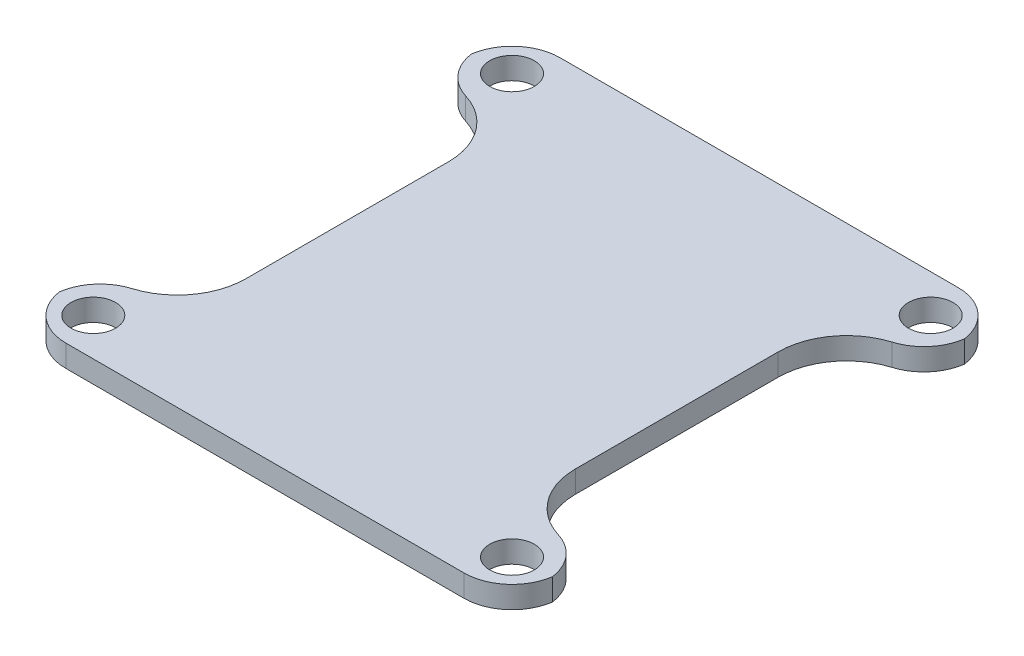
ISO-10303-21;
HEADER;
FILE_DESCRIPTION(('STEP AP214'),'2;1');
FILE_NAME('part.step','',(''),(''),'','','');
FILE_SCHEMA(('AUTOMOTIVE_DESIGN { 1 0 10303 214 1 1 1 1 }'));
ENDSEC;
DATA;
#1=APPLICATION_CONTEXT('core data for automotive mechanical design processes');
#2=APPLICATION_PROTOCOL_DEFINITION('international standard','automotive_design',2000,#1);
#3=PRODUCT_CONTEXT('',#1,'mechanical');
#4=PRODUCT('Part','Part','',(#3));
#5=PRODUCT_RELATED_PRODUCT_CATEGORY('part','',(#4));
#6=PRODUCT_DEFINITION_FORMATION('','',#4);
#7=PRODUCT_DEFINITION_CONTEXT('part definition',#1,'design');
#8=PRODUCT_DEFINITION('design','',#6,#7);
#9=PRODUCT_DEFINITION_SHAPE('','',#8);
#10=(LENGTH_UNIT() NAMED_UNIT(*) SI_UNIT(.MILLI.,.METRE.));
#11=(NAMED_UNIT(*) PLANE_ANGLE_UNIT() SI_UNIT($,.RADIAN.));
#12=(NAMED_UNIT(*) SI_UNIT($,.STERADIAN.) SOLID_ANGLE_UNIT());
#13=UNCERTAINTY_MEASURE_WITH_UNIT(LENGTH_MEASURE(1.E-05),#10,'distance_accuracy_value','');
#14=(GEOMETRIC_REPRESENTATION_CONTEXT(3) GLOBAL_UNCERTAINTY_ASSIGNED_CONTEXT((#13)) GLOBAL_UNIT_ASSIGNED_CONTEXT((#10,
#11,#12)) REPRESENTATION_CONTEXT('',''));
#15=CARTESIAN_POINT('',(0.,0.,0.));
#16=DIRECTION('',(0.,0.,1.));
#17=DIRECTION('',(1.,0.,0.));
#18=AXIS2_PLACEMENT_3D('',#15,#16,#17);
#19=CARTESIAN_POINT('',(-12.,1.6,0.));
#20=DIRECTION('',(1.,0.,0.));
#21=DIRECTION('',(0.,0.,-1.));
#22=AXIS2_PLACEMENT_3D('',#19,#20,#21);
#23=PLANE('',#22);
#24=DIRECTION('',(0.,0.,1.));
#25=VECTOR('',#24,1.);
#26=CARTESIAN_POINT('',(-12.,0.,0.));
#27=LINE('',#26,#25);
#28=CARTESIAN_POINT('',(-12.,0.,-7.37596159536404));
#29=VERTEX_POINT('',#28);
#30=CARTESIAN_POINT('',(-12.,0.,7.37596159536404));
#31=VERTEX_POINT('',#30);
#32=EDGE_CURVE('E187',#29,#31,#27,.T.);
#33=ORIENTED_EDGE('',*,*,#32,.T.);
#34=DIRECTION('',(0.,-1.,0.));
#35=VECTOR('',#34,1.);
#36=CARTESIAN_POINT('',(-12.,1.6,7.37596159536404));
#37=LINE('',#36,#35);
#38=CARTESIAN_POINT('',(-12.,1.6,7.37596159536404));
#39=VERTEX_POINT('',#38);
#40=EDGE_CURVE('E208',#31,#39,#37,.F.);
#41=ORIENTED_EDGE('',*,*,#40,.T.);
#42=DIRECTION('',(0.,0.,1.));
#43=VECTOR('',#42,1.);
#44=CARTESIAN_POINT('',(-12.,1.6,0.));
#45=LINE('',#44,#43);
#46=CARTESIAN_POINT('',(-12.,1.6,-7.37596159536404));
#47=VERTEX_POINT('',#46);
#48=EDGE_CURVE('E231',#47,#39,#45,.T.);
#49=ORIENTED_EDGE('',*,*,#48,.F.);
#50=DIRECTION('',(0.,1.,0.));
#51=VECTOR('',#50,1.);
#52=CARTESIAN_POINT('',(-12.,1.6,-7.37596159536404));
#53=LINE('',#52,#51);
#54=EDGE_CURVE('E205',#47,#29,#53,.F.);
#55=ORIENTED_EDGE('',*,*,#54,.T.);
#56=EDGE_LOOP('',(#33,#41,#49,#55));
#57=FACE_BOUND('',#56,.T.);
#58=ADVANCED_FACE('F37',(#57),#23,.F.);
#59=CARTESIAN_POINT('',(0.,1.6,18.));
#60=DIRECTION('',(0.,0.,-1.));
#61=DIRECTION('',(-1.,0.,0.));
#62=AXIS2_PLACEMENT_3D('',#59,#60,#61);
#63=PLANE('',#62);
#64=DIRECTION('',(1.,0.,0.));
#65=VECTOR('',#64,1.);
#66=CARTESIAN_POINT('',(0.,0.,18.));
#67=LINE('',#66,#65);
#68=CARTESIAN_POINT('',(-14.5,0.,18.));
#69=VERTEX_POINT('',#68);
#70=CARTESIAN_POINT('',(14.5,0.,18.));
#71=VERTEX_POINT('',#70);
#72=EDGE_CURVE('E248',#69,#71,#67,.T.);
#73=ORIENTED_EDGE('',*,*,#72,.T.);
#74=DIRECTION('',(0.,-1.,0.));
#75=VECTOR('',#74,1.);
#76=CARTESIAN_POINT('',(14.5,1.6,18.));
#77=LINE('',#76,#75);
#78=CARTESIAN_POINT('',(14.5,1.6,18.));
#79=VERTEX_POINT('',#78);
#80=EDGE_CURVE('E180',#71,#79,#77,.F.);
#81=ORIENTED_EDGE('',*,*,#80,.T.);
#82=DIRECTION('',(1.,0.,0.));
#83=VECTOR('',#82,1.);
#84=CARTESIAN_POINT('',(0.,1.6,18.));
#85=LINE('',#84,#83);
#86=CARTESIAN_POINT('',(-14.5,1.6,18.));
#87=VERTEX_POINT('',#86);
#88=EDGE_CURVE('E298',#87,#79,#85,.T.);
#89=ORIENTED_EDGE('',*,*,#88,.F.);
#90=DIRECTION('',(0.,-1.,0.));
#91=VECTOR('',#90,1.);
#92=CARTESIAN_POINT('',(-14.5,1.6,18.));
#93=LINE('',#92,#91);
#94=EDGE_CURVE('E292',#87,#69,#93,.T.);
#95=ORIENTED_EDGE('',*,*,#94,.T.);
#96=EDGE_LOOP('',(#73,#81,#89,#95));
#97=FACE_BOUND('',#96,.T.);
#98=ADVANCED_FACE('F297',(#97),#63,.F.);
#99=CARTESIAN_POINT('',(12.,1.6,0.));
#100=DIRECTION('',(1.,0.,0.));
#101=DIRECTION('',(0.,0.,-1.));
#102=AXIS2_PLACEMENT_3D('',#99,#100,#101);
#103=PLANE('',#102);
#104=DIRECTION('',(0.,0.,1.));
#105=VECTOR('',#104,1.);
#106=CARTESIAN_POINT('',(12.,0.,0.));
#107=LINE('',#106,#105);
#108=CARTESIAN_POINT('',(12.,0.,-7.37596159536404));
#109=VERTEX_POINT('',#108);
#110=CARTESIAN_POINT('',(12.,0.,7.37596159536404));
#111=VERTEX_POINT('',#110);
#112=EDGE_CURVE('E170',#109,#111,#107,.T.);
#113=ORIENTED_EDGE('',*,*,#112,.F.);
#114=DIRECTION('',(0.,1.,0.));
#115=VECTOR('',#114,1.);
#116=CARTESIAN_POINT('',(12.,1.6,-7.37596159536404));
#117=LINE('',#116,#115);
#118=CARTESIAN_POINT('',(12.,1.6,-7.37596159536404));
#119=VERTEX_POINT('',#118);
#120=EDGE_CURVE('E198',#109,#119,#117,.T.);
#121=ORIENTED_EDGE('',*,*,#120,.T.);
#122=DIRECTION('',(0.,0.,1.));
#123=VECTOR('',#122,1.);
#124=CARTESIAN_POINT('',(12.,1.6,0.));
#125=LINE('',#124,#123);
#126=CARTESIAN_POINT('',(12.,1.6,7.37596159536404));
#127=VERTEX_POINT('',#126);
#128=EDGE_CURVE('E305',#119,#127,#125,.T.);
#129=ORIENTED_EDGE('',*,*,#128,.T.);
#130=DIRECTION('',(0.,-1.,0.));
#131=VECTOR('',#130,1.);
#132=CARTESIAN_POINT('',(12.,0.,7.37596159536404));
#133=LINE('',#132,#131);
#134=EDGE_CURVE('E178',#127,#111,#133,.T.);
#135=ORIENTED_EDGE('',*,*,#134,.T.);
#136=EDGE_LOOP('',(#113,#121,#129,#135));
#137=FACE_BOUND('',#136,.T.);
#138=ADVANCED_FACE('F321',(#137),#103,.T.);
#139=CARTESIAN_POINT('',(0.,1.6,-18.));
#140=DIRECTION('',(0.,0.,-1.));
#141=DIRECTION('',(-1.,0.,0.));
#142=AXIS2_PLACEMENT_3D('',#139,#140,#141);
#143=PLANE('',#142);
#144=DIRECTION('',(1.,0.,0.));
#145=VECTOR('',#144,1.);
#146=CARTESIAN_POINT('',(0.,0.,-18.));
#147=LINE('',#146,#145);
#148=CARTESIAN_POINT('',(-14.5,0.,-18.));
#149=VERTEX_POINT('',#148);
#150=CARTESIAN_POINT('',(14.5,0.,-18.));
#151=VERTEX_POINT('',#150);
#152=EDGE_CURVE('E153',#149,#151,#147,.T.);
#153=ORIENTED_EDGE('',*,*,#152,.F.);
#154=DIRECTION('',(0.,-1.,0.));
#155=VECTOR('',#154,1.);
#156=CARTESIAN_POINT('',(-14.5,1.6,-18.));
#157=LINE('',#156,#155);
#158=CARTESIAN_POINT('',(-14.5,1.6,-18.));
#159=VERTEX_POINT('',#158);
#160=EDGE_CURVE('E165',#149,#159,#157,.F.);
#161=ORIENTED_EDGE('',*,*,#160,.T.);
#162=DIRECTION('',(1.,0.,0.));
#163=VECTOR('',#162,1.);
#164=CARTESIAN_POINT('',(0.,1.6,-18.));
#165=LINE('',#164,#163);
#166=CARTESIAN_POINT('',(14.5,1.6,-18.));
#167=VERTEX_POINT('',#166);
#168=EDGE_CURVE('E427',#159,#167,#165,.T.);
#169=ORIENTED_EDGE('',*,*,#168,.T.);
#170=DIRECTION('',(0.,-1.,0.));
#171=VECTOR('',#170,1.);
#172=CARTESIAN_POINT('',(14.5,1.6,-18.));
#173=LINE('',#172,#171);
#174=EDGE_CURVE('E168',#167,#151,#173,.T.);
#175=ORIENTED_EDGE('',*,*,#174,.T.);
#176=EDGE_LOOP('',(#153,#161,#169,#175));
#177=FACE_BOUND('',#176,.T.);
#178=ADVANCED_FACE('F163',(#177),#143,.T.);
#179=CARTESIAN_POINT('',(-15.25,1.6,15.25));
#180=DIRECTION('',(0.,-1.,0.));
#181=DIRECTION('',(0.,0.,-1.));
#182=AXIS2_PLACEMENT_3D('',#179,#180,#181);
#183=CYLINDRICAL_SURFACE('',#182,1.625);
#184=CARTESIAN_POINT('',(-15.25,1.6,15.25));
#185=DIRECTION('',(0.,1.,0.));
#186=DIRECTION('',(0.,0.,1.));
#187=AXIS2_PLACEMENT_3D('',#184,#185,#186);
#188=CIRCLE('',#187,1.625);
#189=CARTESIAN_POINT('',(-15.25,1.6,16.875));
#190=VERTEX_POINT('',#189);
#191=EDGE_CURVE('E434',#190,#190,#188,.F.);
#192=ORIENTED_EDGE('',*,*,#191,.F.);
#193=EDGE_LOOP('',(#192));
#194=FACE_BOUND('',#193,.T.);
#195=CARTESIAN_POINT('',(-15.25,0.,15.25));
#196=DIRECTION('',(0.,1.,0.));
#197=DIRECTION('',(0.,0.,1.));
#198=AXIS2_PLACEMENT_3D('',#195,#196,#197);
#199=CIRCLE('',#198,1.625);
#200=CARTESIAN_POINT('',(-15.25,0.,16.875));
#201=VERTEX_POINT('',#200);
#202=EDGE_CURVE('E262',#201,#201,#199,.F.);
#203=ORIENTED_EDGE('',*,*,#202,.T.);
#204=EDGE_LOOP('',(#203));
#205=FACE_BOUND('',#204,.T.);
#206=ADVANCED_FACE('F454',(#194,#205),#183,.F.);
#207=CARTESIAN_POINT('',(15.25,1.6,-15.25));
#208=DIRECTION('',(0.,-1.,0.));
#209=DIRECTION('',(0.,0.,-1.));
#210=AXIS2_PLACEMENT_3D('',#207,#208,#209);
#211=CYLINDRICAL_SURFACE('',#210,1.625);
#212=CARTESIAN_POINT('',(15.25,1.6,-15.25));
#213=DIRECTION('',(0.,1.,0.));
#214=DIRECTION('',(0.,0.,1.));
#215=AXIS2_PLACEMENT_3D('',#212,#213,#214);
#216=CIRCLE('',#215,1.625);
#217=CARTESIAN_POINT('',(15.25,1.6,-13.625));
#218=VERTEX_POINT('',#217);
#219=EDGE_CURVE('E432',#218,#218,#216,.F.);
#220=ORIENTED_EDGE('',*,*,#219,.F.);
#221=EDGE_LOOP('',(#220));
#222=FACE_BOUND('',#221,.T.);
#223=CARTESIAN_POINT('',(15.25,0.,-15.25));
#224=DIRECTION('',(0.,1.,0.));
#225=DIRECTION('',(0.,0.,1.));
#226=AXIS2_PLACEMENT_3D('',#223,#224,#225);
#227=CIRCLE('',#226,1.625);
#228=CARTESIAN_POINT('',(15.25,0.,-13.625));
#229=VERTEX_POINT('',#228);
#230=EDGE_CURVE('E259',#229,#229,#227,.F.);
#231=ORIENTED_EDGE('',*,*,#230,.T.);
#232=EDGE_LOOP('',(#231));
#233=FACE_BOUND('',#232,.T.);
#234=ADVANCED_FACE('F457',(#222,#233),#211,.F.);
#235=CARTESIAN_POINT('',(-15.25,1.6,-15.25));
#236=DIRECTION('',(0.,-1.,0.));
#237=DIRECTION('',(0.,0.,-1.));
#238=AXIS2_PLACEMENT_3D('',#235,#236,#237);
#239=CYLINDRICAL_SURFACE('',#238,1.625);
#240=CARTESIAN_POINT('',(-15.25,1.6,-15.25));
#241=DIRECTION('',(0.,1.,0.));
#242=DIRECTION('',(0.,0.,1.));
#243=AXIS2_PLACEMENT_3D('',#240,#241,#242);
#244=CIRCLE('',#243,1.625);
#245=CARTESIAN_POINT('',(-15.25,1.6,-13.625));
#246=VERTEX_POINT('',#245);
#247=EDGE_CURVE('E429',#246,#246,#244,.T.);
#248=ORIENTED_EDGE('',*,*,#247,.T.);
#249=EDGE_LOOP('',(#248));
#250=FACE_BOUND('',#249,.T.);
#251=CARTESIAN_POINT('',(-15.25,0.,-15.25));
#252=DIRECTION('',(0.,1.,0.));
#253=DIRECTION('',(0.,0.,1.));
#254=AXIS2_PLACEMENT_3D('',#251,#252,#253);
#255=CIRCLE('',#254,1.625);
#256=CARTESIAN_POINT('',(-15.25,0.,-13.625));
#257=VERTEX_POINT('',#256);
#258=EDGE_CURVE('E169',#257,#257,#255,.T.);
#259=ORIENTED_EDGE('',*,*,#258,.F.);
#260=EDGE_LOOP('',(#259));
#261=FACE_BOUND('',#260,.T.);
#262=ADVANCED_FACE('F451',(#250,#261),#239,.F.);
#263=CARTESIAN_POINT('',(15.25,1.6,15.25));
#264=DIRECTION('',(0.,-1.,0.));
#265=DIRECTION('',(0.,0.,-1.));
#266=AXIS2_PLACEMENT_3D('',#263,#264,#265);
#267=CYLINDRICAL_SURFACE('',#266,1.625);
#268=CARTESIAN_POINT('',(15.25,1.6,15.25));
#269=DIRECTION('',(0.,1.,0.));
#270=DIRECTION('',(0.,0.,1.));
#271=AXIS2_PLACEMENT_3D('',#268,#269,#270);
#272=CIRCLE('',#271,1.625);
#273=CARTESIAN_POINT('',(15.25,1.6,16.875));
#274=VERTEX_POINT('',#273);
#275=EDGE_CURVE('E253',#274,#274,#272,.T.);
#276=ORIENTED_EDGE('',*,*,#275,.T.);
#277=EDGE_LOOP('',(#276));
#278=FACE_BOUND('',#277,.T.);
#279=CARTESIAN_POINT('',(15.25,0.,15.25));
#280=DIRECTION('',(0.,1.,0.));
#281=DIRECTION('',(0.,0.,1.));
#282=AXIS2_PLACEMENT_3D('',#279,#280,#281);
#283=CIRCLE('',#282,1.625);
#284=CARTESIAN_POINT('',(15.25,0.,16.875));
#285=VERTEX_POINT('',#284);
#286=EDGE_CURVE('E265',#285,#285,#283,.T.);
#287=ORIENTED_EDGE('',*,*,#286,.F.);
#288=EDGE_LOOP('',(#287));
#289=FACE_BOUND('',#288,.T.);
#290=ADVANCED_FACE('F441',(#278,#289),#267,.F.);
#291=CARTESIAN_POINT('',(0.,1.6,0.));
#292=DIRECTION('',(0.,1.,0.));
#293=DIRECTION('',(0.,0.,1.));
#294=AXIS2_PLACEMENT_3D('',#291,#292,#293);
#295=PLANE('',#294);
#296=CARTESIAN_POINT('',(14.5,1.6,14.5));
#297=DIRECTION('',(0.,1.,0.));
#298=DIRECTION('',(0.,0.,1.));
#299=AXIS2_PLACEMENT_3D('',#296,#297,#298);
#300=CIRCLE('',#299,3.5);
#301=CARTESIAN_POINT('',(17.9641016151377,1.6,15.));
#302=VERTEX_POINT('',#301);
#303=EDGE_CURVE('E240',#79,#302,#300,.T.);
#304=ORIENTED_EDGE('',*,*,#303,.T.);
#305=CARTESIAN_POINT('',(14.5,1.6,15.5));
#306=DIRECTION('',(0.,1.,0.));
#307=DIRECTION('',(0.,0.,1.));
#308=AXIS2_PLACEMENT_3D('',#305,#306,#307);
#309=CIRCLE('',#308,3.5);
#310=CARTESIAN_POINT('',(15.5294117647059,1.6,12.1548077157381));
#311=VERTEX_POINT('',#310);
#312=EDGE_CURVE('E289',#302,#311,#309,.T.);
#313=ORIENTED_EDGE('',*,*,#312,.T.);
#314=CARTESIAN_POINT('',(17.,1.6,7.37596159536404));
#315=DIRECTION('',(0.,1.,0.));
#316=DIRECTION('',(0.,0.,1.));
#317=AXIS2_PLACEMENT_3D('',#314,#315,#316);
#318=CIRCLE('',#317,5.);
#319=EDGE_CURVE('E217',#311,#127,#318,.F.);
#320=ORIENTED_EDGE('',*,*,#319,.T.);
#321=ORIENTED_EDGE('',*,*,#128,.F.);
#322=CARTESIAN_POINT('',(17.,1.6,-7.37596159536404));
#323=DIRECTION('',(0.,1.,0.));
#324=DIRECTION('',(0.,0.,1.));
#325=AXIS2_PLACEMENT_3D('',#322,#323,#324);
#326=CIRCLE('',#325,5.);
#327=CARTESIAN_POINT('',(15.5294117647059,1.6,-12.1548077157381));
#328=VERTEX_POINT('',#327);
#329=EDGE_CURVE('E213',#119,#328,#326,.F.);
#330=ORIENTED_EDGE('',*,*,#329,.T.);
#331=CARTESIAN_POINT('',(14.5,1.6,-15.5));
#332=DIRECTION('',(0.,1.,0.));
#333=DIRECTION('',(0.,0.,1.));
#334=AXIS2_PLACEMENT_3D('',#331,#332,#333);
#335=CIRCLE('',#334,3.5);
#336=CARTESIAN_POINT('',(17.9641016151378,1.6,-15.));
#337=VERTEX_POINT('',#336);
#338=EDGE_CURVE('E282',#328,#337,#335,.T.);
#339=ORIENTED_EDGE('',*,*,#338,.T.);
#340=CARTESIAN_POINT('',(14.5,1.6,-14.5));
#341=DIRECTION('',(0.,1.,0.));
#342=DIRECTION('',(0.,0.,1.));
#343=AXIS2_PLACEMENT_3D('',#340,#341,#342);
#344=CIRCLE('',#343,3.5);
#345=EDGE_CURVE('E280',#337,#167,#344,.T.);
#346=ORIENTED_EDGE('',*,*,#345,.T.);
#347=ORIENTED_EDGE('',*,*,#168,.F.);
#348=CARTESIAN_POINT('',(-14.5,1.6,-14.5));
#349=DIRECTION('',(0.,1.,0.));
#350=DIRECTION('',(0.,0.,1.));
#351=AXIS2_PLACEMENT_3D('',#348,#349,#350);
#352=CIRCLE('',#351,3.5);
#353=CARTESIAN_POINT('',(-17.9641016151377,1.6,-15.));
#354=VERTEX_POINT('',#353);
#355=EDGE_CURVE('E174',#159,#354,#352,.T.);
#356=ORIENTED_EDGE('',*,*,#355,.T.);
#357=CARTESIAN_POINT('',(-14.5,1.6,-15.5));
#358=DIRECTION('',(0.,1.,0.));
#359=DIRECTION('',(0.,0.,1.));
#360=AXIS2_PLACEMENT_3D('',#357,#358,#359);
#361=CIRCLE('',#360,3.5);
#362=CARTESIAN_POINT('',(-15.5294117647059,1.6,-12.1548077157381));
#363=VERTEX_POINT('',#362);
#364=EDGE_CURVE('E285',#354,#363,#361,.T.);
#365=ORIENTED_EDGE('',*,*,#364,.T.);
#366=CARTESIAN_POINT('',(-17.,1.6,-7.37596159536404));
#367=DIRECTION('',(0.,1.,0.));
#368=DIRECTION('',(0.,0.,1.));
#369=AXIS2_PLACEMENT_3D('',#366,#367,#368);
#370=CIRCLE('',#369,5.);
#371=EDGE_CURVE('E11',#363,#47,#370,.F.);
#372=ORIENTED_EDGE('',*,*,#371,.T.);
#373=ORIENTED_EDGE('',*,*,#48,.T.);
#374=CARTESIAN_POINT('',(-17.,1.6,7.37596159536404));
#375=DIRECTION('',(0.,1.,0.));
#376=DIRECTION('',(0.,0.,1.));
#377=AXIS2_PLACEMENT_3D('',#374,#375,#376);
#378=CIRCLE('',#377,5.);
#379=CARTESIAN_POINT('',(-15.5294117647059,1.6,12.1548077157381));
#380=VERTEX_POINT('',#379);
#381=EDGE_CURVE('E221',#39,#380,#378,.F.);
#382=ORIENTED_EDGE('',*,*,#381,.T.);
#383=CARTESIAN_POINT('',(-14.5,1.6,15.5));
#384=DIRECTION('',(0.,1.,0.));
#385=DIRECTION('',(0.,0.,1.));
#386=AXIS2_PLACEMENT_3D('',#383,#384,#385);
#387=CIRCLE('',#386,3.5);
#388=CARTESIAN_POINT('',(-17.9641016151377,1.6,15.));
#389=VERTEX_POINT('',#388);
#390=EDGE_CURVE('E228',#380,#389,#387,.T.);
#391=ORIENTED_EDGE('',*,*,#390,.T.);
#392=CARTESIAN_POINT('',(-14.5,1.6,14.5));
#393=DIRECTION('',(0.,1.,0.));
#394=DIRECTION('',(0.,0.,1.));
#395=AXIS2_PLACEMENT_3D('',#392,#393,#394);
#396=CIRCLE('',#395,3.5);
#397=EDGE_CURVE('E241',#389,#87,#396,.T.);
#398=ORIENTED_EDGE('',*,*,#397,.T.);
#399=ORIENTED_EDGE('',*,*,#88,.T.);
#400=EDGE_LOOP('',(#304,#313,#320,#321,#330,#339,#346,#347,#356,#365,#372,#373,#382,#391,#398,#399));
#401=FACE_BOUND('',#400,.T.);
#402=ORIENTED_EDGE('',*,*,#247,.F.);
#403=EDGE_LOOP('',(#402));
#404=FACE_BOUND('',#403,.T.);
#405=ORIENTED_EDGE('',*,*,#219,.T.);
#406=EDGE_LOOP('',(#405));
#407=FACE_BOUND('',#406,.T.);
#408=ORIENTED_EDGE('',*,*,#191,.T.);
#409=EDGE_LOOP('',(#408));
#410=FACE_BOUND('',#409,.T.);
#411=ORIENTED_EDGE('',*,*,#275,.F.);
#412=EDGE_LOOP('',(#411));
#413=FACE_BOUND('',#412,.T.);
#414=ADVANCED_FACE('F226',(#401,#404,#407,#410,#413),#295,.T.);
#415=CARTESIAN_POINT('',(0.,0.,0.));
#416=DIRECTION('',(0.,1.,0.));
#417=DIRECTION('',(0.,0.,1.));
#418=AXIS2_PLACEMENT_3D('',#415,#416,#417);
#419=PLANE('',#418);
#420=ORIENTED_EDGE('',*,*,#112,.T.);
#421=CARTESIAN_POINT('',(17.,0.,7.37596159536404));
#422=DIRECTION('',(0.,1.,0.));
#423=DIRECTION('',(0.,0.,1.));
#424=AXIS2_PLACEMENT_3D('',#421,#422,#423);
#425=CIRCLE('',#424,5.);
#426=CARTESIAN_POINT('',(15.5294117647059,0.,12.1548077157381));
#427=VERTEX_POINT('',#426);
#428=EDGE_CURVE('E215',#111,#427,#425,.T.);
#429=ORIENTED_EDGE('',*,*,#428,.T.);
#430=CARTESIAN_POINT('',(14.5,0.,15.5));
#431=DIRECTION('',(0.,1.,0.));
#432=DIRECTION('',(0.,0.,1.));
#433=AXIS2_PLACEMENT_3D('',#430,#431,#432);
#434=CIRCLE('',#433,3.5);
#435=CARTESIAN_POINT('',(17.9641016151377,0.,15.));
#436=VERTEX_POINT('',#435);
#437=EDGE_CURVE('E278',#427,#436,#434,.F.);
#438=ORIENTED_EDGE('',*,*,#437,.T.);
#439=CARTESIAN_POINT('',(14.5,0.,14.5));
#440=DIRECTION('',(0.,1.,0.));
#441=DIRECTION('',(0.,0.,1.));
#442=AXIS2_PLACEMENT_3D('',#439,#440,#441);
#443=CIRCLE('',#442,3.5);
#444=EDGE_CURVE('E276',#436,#71,#443,.F.);
#445=ORIENTED_EDGE('',*,*,#444,.T.);
#446=ORIENTED_EDGE('',*,*,#72,.F.);
#447=CARTESIAN_POINT('',(-14.5,0.,14.5));
#448=DIRECTION('',(0.,1.,0.));
#449=DIRECTION('',(0.,0.,1.));
#450=AXIS2_PLACEMENT_3D('',#447,#448,#449);
#451=CIRCLE('',#450,3.5);
#452=CARTESIAN_POINT('',(-17.9641016151377,0.,15.));
#453=VERTEX_POINT('',#452);
#454=EDGE_CURVE('E273',#69,#453,#451,.F.);
#455=ORIENTED_EDGE('',*,*,#454,.T.);
#456=CARTESIAN_POINT('',(-14.5,0.,15.5));
#457=DIRECTION('',(0.,1.,0.));
#458=DIRECTION('',(0.,0.,1.));
#459=AXIS2_PLACEMENT_3D('',#456,#457,#458);
#460=CIRCLE('',#459,3.5);
#461=CARTESIAN_POINT('',(-15.5294117647059,0.,12.1548077157381));
#462=VERTEX_POINT('',#461);
#463=EDGE_CURVE('E245',#453,#462,#460,.F.);
#464=ORIENTED_EDGE('',*,*,#463,.T.);
#465=CARTESIAN_POINT('',(-17.,0.,7.37596159536404));
#466=DIRECTION('',(0.,1.,0.));
#467=DIRECTION('',(0.,0.,1.));
#468=AXIS2_PLACEMENT_3D('',#465,#466,#467);
#469=CIRCLE('',#468,5.);
#470=EDGE_CURVE('E219',#462,#31,#469,.T.);
#471=ORIENTED_EDGE('',*,*,#470,.T.);
#472=ORIENTED_EDGE('',*,*,#32,.F.);
#473=CARTESIAN_POINT('',(-17.,0.,-7.37596159536404));
#474=DIRECTION('',(0.,1.,0.));
#475=DIRECTION('',(0.,0.,1.));
#476=AXIS2_PLACEMENT_3D('',#473,#474,#475);
#477=CIRCLE('',#476,5.);
#478=CARTESIAN_POINT('',(-15.5294117647059,0.,-12.1548077157381));
#479=VERTEX_POINT('',#478);
#480=EDGE_CURVE('E45',#29,#479,#477,.T.);
#481=ORIENTED_EDGE('',*,*,#480,.T.);
#482=CARTESIAN_POINT('',(-14.5,0.,-15.5));
#483=DIRECTION('',(0.,1.,0.));
#484=DIRECTION('',(0.,0.,1.));
#485=AXIS2_PLACEMENT_3D('',#482,#483,#484);
#486=CIRCLE('',#485,3.5);
#487=CARTESIAN_POINT('',(-17.9641016151377,0.,-15.));
#488=VERTEX_POINT('',#487);
#489=EDGE_CURVE('E155',#479,#488,#486,.F.);
#490=ORIENTED_EDGE('',*,*,#489,.T.);
#491=CARTESIAN_POINT('',(-14.5,0.,-14.5));
#492=DIRECTION('',(0.,1.,0.));
#493=DIRECTION('',(0.,0.,1.));
#494=AXIS2_PLACEMENT_3D('',#491,#492,#493);
#495=CIRCLE('',#494,3.5);
#496=EDGE_CURVE('E148',#488,#149,#495,.F.);
#497=ORIENTED_EDGE('',*,*,#496,.T.);
#498=ORIENTED_EDGE('',*,*,#152,.T.);
#499=CARTESIAN_POINT('',(14.5,0.,-14.5));
#500=DIRECTION('',(0.,1.,0.));
#501=DIRECTION('',(0.,0.,1.));
#502=AXIS2_PLACEMENT_3D('',#499,#500,#501);
#503=CIRCLE('',#502,3.5);
#504=CARTESIAN_POINT('',(17.9641016151378,0.,-15.));
#505=VERTEX_POINT('',#504);
#506=EDGE_CURVE('E268',#151,#505,#503,.F.);
#507=ORIENTED_EDGE('',*,*,#506,.T.);
#508=CARTESIAN_POINT('',(14.5,0.,-15.5));
#509=DIRECTION('',(0.,1.,0.));
#510=DIRECTION('',(0.,0.,1.));
#511=AXIS2_PLACEMENT_3D('',#508,#509,#510);
#512=CIRCLE('',#511,3.5);
#513=CARTESIAN_POINT('',(15.5294117647059,0.,-12.1548077157381));
#514=VERTEX_POINT('',#513);
#515=EDGE_CURVE('E160',#505,#514,#512,.F.);
#516=ORIENTED_EDGE('',*,*,#515,.T.);
#517=CARTESIAN_POINT('',(17.,0.,-7.37596159536404));
#518=DIRECTION('',(0.,1.,0.));
#519=DIRECTION('',(0.,0.,1.));
#520=AXIS2_PLACEMENT_3D('',#517,#518,#519);
#521=CIRCLE('',#520,5.);
#522=EDGE_CURVE('E211',#514,#109,#521,.T.);
#523=ORIENTED_EDGE('',*,*,#522,.T.);
#524=EDGE_LOOP('',(#420,#429,#438,#445,#446,#455,#464,#471,#472,#481,#490,#497,#498,#507,#516,#523));
#525=FACE_BOUND('',#524,.T.);
#526=ORIENTED_EDGE('',*,*,#258,.T.);
#527=EDGE_LOOP('',(#526));
#528=FACE_BOUND('',#527,.T.);
#529=ORIENTED_EDGE('',*,*,#230,.F.);
#530=EDGE_LOOP('',(#529));
#531=FACE_BOUND('',#530,.T.);
#532=ORIENTED_EDGE('',*,*,#202,.F.);
#533=EDGE_LOOP('',(#532));
#534=FACE_BOUND('',#533,.T.);
#535=ORIENTED_EDGE('',*,*,#286,.T.);
#536=EDGE_LOOP('',(#535));
#537=FACE_BOUND('',#536,.T.);
#538=ADVANCED_FACE('F151',(#525,#528,#531,#534,#537),#419,.F.);
#539=CARTESIAN_POINT('',(-14.5,1.6,14.5));
#540=DIRECTION('',(0.,-1.,0.));
#541=DIRECTION('',(0.,0.,-1.));
#542=AXIS2_PLACEMENT_3D('',#539,#540,#541);
#543=CYLINDRICAL_SURFACE('',#542,3.5);
#544=ORIENTED_EDGE('',*,*,#94,.F.);
#545=ORIENTED_EDGE('',*,*,#397,.F.);
#546=DIRECTION('',(0.,-1.,0.));
#547=VECTOR('',#546,1.);
#548=CARTESIAN_POINT('',(-17.9641016151377,0.8,15.));
#549=LINE('',#548,#547);
#550=EDGE_CURVE('E184',#453,#389,#549,.F.);
#551=ORIENTED_EDGE('',*,*,#550,.F.);
#552=ORIENTED_EDGE('',*,*,#454,.F.);
#553=EDGE_LOOP('',(#544,#545,#551,#552));
#554=FACE_BOUND('',#553,.T.);
#555=ADVANCED_FACE('F355',(#554),#543,.T.);
#556=CARTESIAN_POINT('',(-14.5,1.6,15.5));
#557=DIRECTION('',(0.,-1.,0.));
#558=DIRECTION('',(0.,0.,-1.));
#559=AXIS2_PLACEMENT_3D('',#556,#557,#558);
#560=CYLINDRICAL_SURFACE('',#559,3.5);
#561=ORIENTED_EDGE('',*,*,#390,.F.);
#562=DIRECTION('',(0.,-1.,0.));
#563=VECTOR('',#562,1.);
#564=CARTESIAN_POINT('',(-15.5294117647059,1.6,12.1548077157381));
#565=LINE('',#564,#563);
#566=EDGE_CURVE('E202',#380,#462,#565,.T.);
#567=ORIENTED_EDGE('',*,*,#566,.T.);
#568=ORIENTED_EDGE('',*,*,#463,.F.);
#569=ORIENTED_EDGE('',*,*,#550,.T.);
#570=EDGE_LOOP('',(#561,#567,#568,#569));
#571=FACE_BOUND('',#570,.T.);
#572=ADVANCED_FACE('F236',(#571),#560,.T.);
#573=CARTESIAN_POINT('',(-14.5,1.6,-14.5));
#574=DIRECTION('',(0.,1.,0.));
#575=DIRECTION('',(0.,0.,1.));
#576=AXIS2_PLACEMENT_3D('',#573,#574,#575);
#577=CYLINDRICAL_SURFACE('',#576,3.5);
#578=DIRECTION('',(0.,1.,0.));
#579=VECTOR('',#578,1.);
#580=CARTESIAN_POINT('',(-17.9641016151377,0.8,-15.));
#581=LINE('',#580,#579);
#582=EDGE_CURVE('E188',#354,#488,#581,.F.);
#583=ORIENTED_EDGE('',*,*,#582,.F.);
#584=ORIENTED_EDGE('',*,*,#355,.F.);
#585=ORIENTED_EDGE('',*,*,#160,.F.);
#586=ORIENTED_EDGE('',*,*,#496,.F.);
#587=EDGE_LOOP('',(#583,#584,#585,#586));
#588=FACE_BOUND('',#587,.T.);
#589=ADVANCED_FACE('F173',(#588),#577,.T.);
#590=CARTESIAN_POINT('',(-14.5,1.6,-15.5));
#591=DIRECTION('',(0.,1.,0.));
#592=DIRECTION('',(0.,0.,1.));
#593=AXIS2_PLACEMENT_3D('',#590,#591,#592);
#594=CYLINDRICAL_SURFACE('',#593,3.5);
#595=ORIENTED_EDGE('',*,*,#489,.F.);
#596=DIRECTION('',(0.,1.,0.));
#597=VECTOR('',#596,1.);
#598=CARTESIAN_POINT('',(-15.5294117647059,1.6,-12.1548077157381));
#599=LINE('',#598,#597);
#600=EDGE_CURVE('E58',#479,#363,#599,.T.);
#601=ORIENTED_EDGE('',*,*,#600,.T.);
#602=ORIENTED_EDGE('',*,*,#364,.F.);
#603=ORIENTED_EDGE('',*,*,#582,.T.);
#604=EDGE_LOOP('',(#595,#601,#602,#603));
#605=FACE_BOUND('',#604,.T.);
#606=ADVANCED_FACE('F336',(#605),#594,.T.);
#607=CARTESIAN_POINT('',(14.5,1.6,-14.5));
#608=DIRECTION('',(0.,-1.,0.));
#609=DIRECTION('',(0.,0.,-1.));
#610=AXIS2_PLACEMENT_3D('',#607,#608,#609);
#611=CYLINDRICAL_SURFACE('',#610,3.5);
#612=ORIENTED_EDGE('',*,*,#174,.F.);
#613=ORIENTED_EDGE('',*,*,#345,.F.);
#614=DIRECTION('',(0.,-1.,0.));
#615=VECTOR('',#614,1.);
#616=CARTESIAN_POINT('',(17.9641016151378,0.8,-15.));
#617=LINE('',#616,#615);
#618=EDGE_CURVE('E190',#505,#337,#617,.F.);
#619=ORIENTED_EDGE('',*,*,#618,.F.);
#620=ORIENTED_EDGE('',*,*,#506,.F.);
#621=EDGE_LOOP('',(#612,#613,#619,#620));
#622=FACE_BOUND('',#621,.T.);
#623=ADVANCED_FACE('F334',(#622),#611,.T.);
#624=CARTESIAN_POINT('',(14.5,1.6,-15.5));
#625=DIRECTION('',(0.,-1.,0.));
#626=DIRECTION('',(0.,0.,-1.));
#627=AXIS2_PLACEMENT_3D('',#624,#625,#626);
#628=CYLINDRICAL_SURFACE('',#627,3.5);
#629=ORIENTED_EDGE('',*,*,#338,.F.);
#630=DIRECTION('',(0.,-1.,0.));
#631=VECTOR('',#630,1.);
#632=CARTESIAN_POINT('',(15.5294117647059,1.6,-12.1548077157381));
#633=LINE('',#632,#631);
#634=EDGE_CURVE('E175',#328,#514,#633,.T.);
#635=ORIENTED_EDGE('',*,*,#634,.T.);
#636=ORIENTED_EDGE('',*,*,#515,.F.);
#637=ORIENTED_EDGE('',*,*,#618,.T.);
#638=EDGE_LOOP('',(#629,#635,#636,#637));
#639=FACE_BOUND('',#638,.T.);
#640=ADVANCED_FACE('F330',(#639),#628,.T.);
#641=CARTESIAN_POINT('',(14.5,1.6,14.5));
#642=DIRECTION('',(0.,1.,0.));
#643=DIRECTION('',(0.,0.,1.));
#644=AXIS2_PLACEMENT_3D('',#641,#642,#643);
#645=CYLINDRICAL_SURFACE('',#644,3.5);
#646=DIRECTION('',(0.,1.,0.));
#647=VECTOR('',#646,1.);
#648=CARTESIAN_POINT('',(17.9641016151377,0.8,15.));
#649=LINE('',#648,#647);
#650=EDGE_CURVE('E193',#302,#436,#649,.F.);
#651=ORIENTED_EDGE('',*,*,#650,.F.);
#652=ORIENTED_EDGE('',*,*,#303,.F.);
#653=ORIENTED_EDGE('',*,*,#80,.F.);
#654=ORIENTED_EDGE('',*,*,#444,.F.);
#655=EDGE_LOOP('',(#651,#652,#653,#654));
#656=FACE_BOUND('',#655,.T.);
#657=ADVANCED_FACE('F307',(#656),#645,.T.);
#658=CARTESIAN_POINT('',(14.5,1.6,15.5));
#659=DIRECTION('',(0.,1.,0.));
#660=DIRECTION('',(0.,0.,1.));
#661=AXIS2_PLACEMENT_3D('',#658,#659,#660);
#662=CYLINDRICAL_SURFACE('',#661,3.5);
#663=ORIENTED_EDGE('',*,*,#437,.F.);
#664=DIRECTION('',(0.,1.,0.));
#665=VECTOR('',#664,1.);
#666=CARTESIAN_POINT('',(15.5294117647059,1.6,12.1548077157381));
#667=LINE('',#666,#665);
#668=EDGE_CURVE('E200',#427,#311,#667,.T.);
#669=ORIENTED_EDGE('',*,*,#668,.T.);
#670=ORIENTED_EDGE('',*,*,#312,.F.);
#671=ORIENTED_EDGE('',*,*,#650,.T.);
#672=EDGE_LOOP('',(#663,#669,#670,#671));
#673=FACE_BOUND('',#672,.T.);
#674=ADVANCED_FACE('F311',(#673),#662,.T.);
#675=CARTESIAN_POINT('',(17.,1.6,-7.37596159536404));
#676=DIRECTION('',(0.,-1.,0.));
#677=DIRECTION('',(0.,0.,-1.));
#678=AXIS2_PLACEMENT_3D('',#675,#676,#677);
#679=CYLINDRICAL_SURFACE('',#678,5.);
#680=ORIENTED_EDGE('',*,*,#329,.F.);
#681=ORIENTED_EDGE('',*,*,#120,.F.);
#682=ORIENTED_EDGE('',*,*,#522,.F.);
#683=ORIENTED_EDGE('',*,*,#634,.F.);
#684=EDGE_LOOP('',(#680,#681,#682,#683));
#685=FACE_BOUND('',#684,.T.);
#686=ADVANCED_FACE('F327',(#685),#679,.F.);
#687=CARTESIAN_POINT('',(17.,1.6,7.37596159536404));
#688=DIRECTION('',(0.,1.,0.));
#689=DIRECTION('',(0.,0.,1.));
#690=AXIS2_PLACEMENT_3D('',#687,#688,#689);
#691=CYLINDRICAL_SURFACE('',#690,5.);
#692=ORIENTED_EDGE('',*,*,#319,.F.);
#693=ORIENTED_EDGE('',*,*,#668,.F.);
#694=ORIENTED_EDGE('',*,*,#428,.F.);
#695=ORIENTED_EDGE('',*,*,#134,.F.);
#696=EDGE_LOOP('',(#692,#693,#694,#695));
#697=FACE_BOUND('',#696,.T.);
#698=ADVANCED_FACE('F318',(#697),#691,.F.);
#699=CARTESIAN_POINT('',(-17.,1.6,7.37596159536404));
#700=DIRECTION('',(0.,-1.,0.));
#701=DIRECTION('',(0.,0.,-1.));
#702=AXIS2_PLACEMENT_3D('',#699,#700,#701);
#703=CYLINDRICAL_SURFACE('',#702,5.);
#704=ORIENTED_EDGE('',*,*,#381,.F.);
#705=ORIENTED_EDGE('',*,*,#40,.F.);
#706=ORIENTED_EDGE('',*,*,#470,.F.);
#707=ORIENTED_EDGE('',*,*,#566,.F.);
#708=EDGE_LOOP('',(#704,#705,#706,#707));
#709=FACE_BOUND('',#708,.T.);
#710=ADVANCED_FACE('F243',(#709),#703,.F.);
#711=CARTESIAN_POINT('',(-17.,1.6,-7.37596159536404));
#712=DIRECTION('',(0.,1.,0.));
#713=DIRECTION('',(0.,0.,1.));
#714=AXIS2_PLACEMENT_3D('',#711,#712,#713);
#715=CYLINDRICAL_SURFACE('',#714,5.);
#716=ORIENTED_EDGE('',*,*,#371,.F.);
#717=ORIENTED_EDGE('',*,*,#600,.F.);
#718=ORIENTED_EDGE('',*,*,#480,.F.);
#719=ORIENTED_EDGE('',*,*,#54,.F.);
#720=EDGE_LOOP('',(#716,#717,#718,#719));
#721=FACE_BOUND('',#720,.T.);
#722=ADVANCED_FACE('F39',(#721),#715,.F.);
#723=CLOSED_SHELL('',(#58,#98,#138,#178,#206,#234,#262,#290,#414,#538,#555,#572,#589,#606,#623,
#640,#657,#674,#686,#698,#710,#722));
#724=MANIFOLD_SOLID_BREP('B2',#723);
#725=ADVANCED_BREP_SHAPE_REPRESENTATION('',(#18,#724),#14);
#726=SHAPE_DEFINITION_REPRESENTATION(#9,#725);
ENDSEC;
END-ISO-10303-21;
